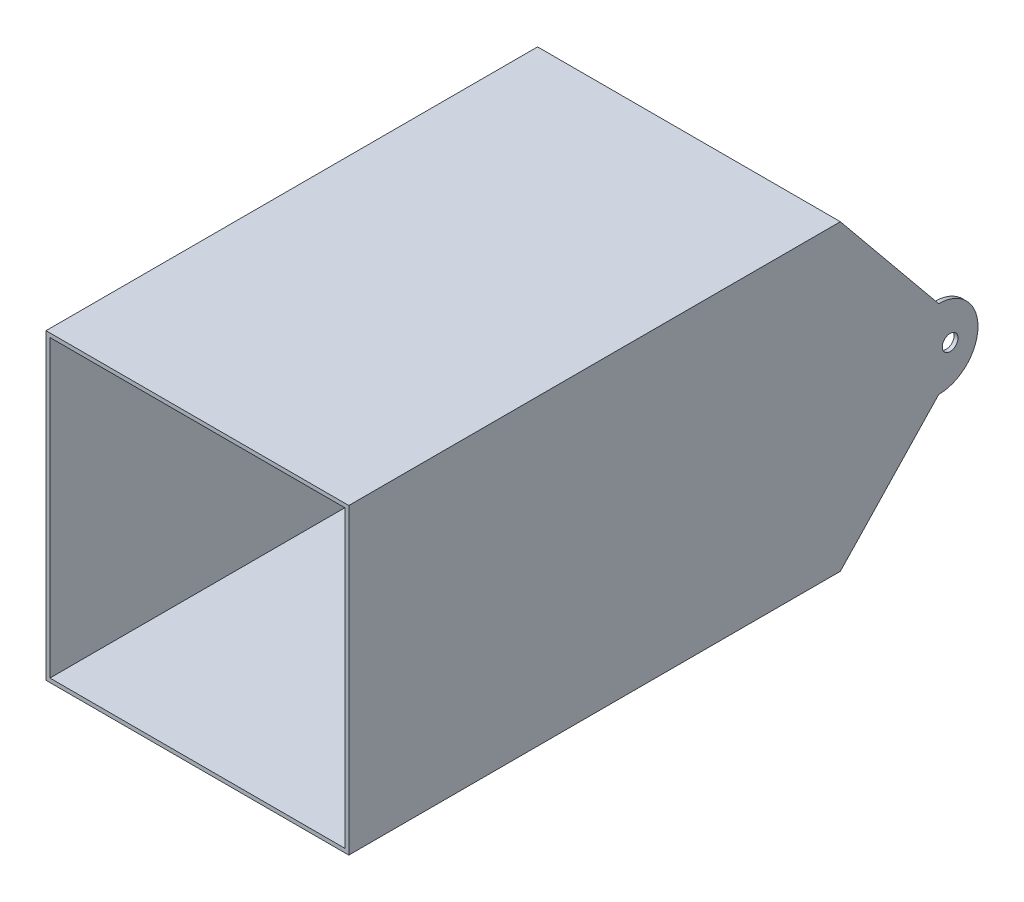
ISO-10303-21;
HEADER;
FILE_DESCRIPTION(('STEP AP214'),'2;1');
FILE_NAME('part.step','',(''),(''),'','','');
FILE_SCHEMA(('AUTOMOTIVE_DESIGN { 1 0 10303 214 1 1 1 1 }'));
ENDSEC;
DATA;
#1=APPLICATION_CONTEXT('core data for automotive mechanical design processes');
#2=APPLICATION_PROTOCOL_DEFINITION('international standard','automotive_design',2000,#1);
#3=PRODUCT_CONTEXT('',#1,'mechanical');
#4=PRODUCT('Part','Part','',(#3));
#5=PRODUCT_RELATED_PRODUCT_CATEGORY('part','',(#4));
#6=PRODUCT_DEFINITION_FORMATION('','',#4);
#7=PRODUCT_DEFINITION_CONTEXT('part definition',#1,'design');
#8=PRODUCT_DEFINITION('design','',#6,#7);
#9=PRODUCT_DEFINITION_SHAPE('','',#8);
#10=(LENGTH_UNIT() NAMED_UNIT(*) SI_UNIT(.MILLI.,.METRE.));
#11=(NAMED_UNIT(*) PLANE_ANGLE_UNIT() SI_UNIT($,.RADIAN.));
#12=(NAMED_UNIT(*) SI_UNIT($,.STERADIAN.) SOLID_ANGLE_UNIT());
#13=UNCERTAINTY_MEASURE_WITH_UNIT(LENGTH_MEASURE(1.E-05),#10,'distance_accuracy_value','');
#14=(GEOMETRIC_REPRESENTATION_CONTEXT(3) GLOBAL_UNCERTAINTY_ASSIGNED_CONTEXT((#13)) GLOBAL_UNIT_ASSIGNED_CONTEXT((#10,
#11,#12)) REPRESENTATION_CONTEXT('',''));
#15=CARTESIAN_POINT('',(0.,0.,0.));
#16=DIRECTION('',(0.,0.,1.));
#17=DIRECTION('',(1.,0.,0.));
#18=AXIS2_PLACEMENT_3D('',#15,#16,#17);
#19=CARTESIAN_POINT('',(0.,0.,-50.));
#20=DIRECTION('',(0.,0.,1.));
#21=DIRECTION('',(1.,0.,0.));
#22=AXIS2_PLACEMENT_3D('',#19,#20,#21);
#23=PLANE('',#22);
#24=DIRECTION('',(1.,0.,0.));
#25=VECTOR('',#24,1.);
#26=CARTESIAN_POINT('',(-77.,-24.1126862652198,-50.));
#27=LINE('',#26,#25);
#28=CARTESIAN_POINT('',(-75.,-24.1126862652198,-50.));
#29=VERTEX_POINT('',#28);
#30=CARTESIAN_POINT('',(75.,-24.1126862652198,-50.));
#31=VERTEX_POINT('',#30);
#32=EDGE_CURVE('E217',#29,#31,#27,.T.);
#33=ORIENTED_EDGE('',*,*,#32,.F.);
#34=DIRECTION('',(0.,-1.,0.));
#35=VECTOR('',#34,1.);
#36=CARTESIAN_POINT('',(-75.,77.,-50.));
#37=LINE('',#36,#35);
#38=CARTESIAN_POINT('',(-75.,-22.1126862652198,-50.));
#39=VERTEX_POINT('',#38);
#40=EDGE_CURVE('E479',#39,#29,#37,.T.);
#41=ORIENTED_EDGE('',*,*,#40,.F.);
#42=DIRECTION('',(1.,0.,0.));
#43=VECTOR('',#42,1.);
#44=CARTESIAN_POINT('',(-75.,-22.1126862652198,-50.));
#45=LINE('',#44,#43);
#46=CARTESIAN_POINT('',(75.,-22.1126862652198,-50.));
#47=VERTEX_POINT('',#46);
#48=EDGE_CURVE('E168',#39,#47,#45,.T.);
#49=ORIENTED_EDGE('',*,*,#48,.T.);
#50=DIRECTION('',(0.,-1.,0.));
#51=VECTOR('',#50,1.);
#52=CARTESIAN_POINT('',(75.,15.8873137347802,-50.));
#53=LINE('',#52,#51);
#54=EDGE_CURVE('E485',#47,#31,#53,.T.);
#55=ORIENTED_EDGE('',*,*,#54,.T.);
#56=EDGE_LOOP('',(#33,#41,#49,#55));
#57=FACE_BOUND('',#56,.T.);
#58=ADVANCED_FACE('F51',(#57),#23,.F.);
#59=DIRECTION('',(1.,0.,0.));
#60=VECTOR('',#59,1.);
#61=CARTESIAN_POINT('',(-75.,13.8873137347802,-50.));
#62=LINE('',#61,#60);
#63=CARTESIAN_POINT('',(-75.,13.8873137347802,-50.));
#64=VERTEX_POINT('',#63);
#65=CARTESIAN_POINT('',(75.,13.8873137347802,-50.));
#66=VERTEX_POINT('',#65);
#67=EDGE_CURVE('E523',#64,#66,#62,.T.);
#68=ORIENTED_EDGE('',*,*,#67,.F.);
#69=CARTESIAN_POINT('',(-75.,15.8873137347802,-50.));
#70=VERTEX_POINT('',#69);
#71=EDGE_CURVE('E259',#70,#64,#37,.T.);
#72=ORIENTED_EDGE('',*,*,#71,.F.);
#73=DIRECTION('',(1.,0.,0.));
#74=VECTOR('',#73,1.);
#75=CARTESIAN_POINT('',(-77.,15.8873137347802,-50.));
#76=LINE('',#75,#74);
#77=CARTESIAN_POINT('',(75.,15.8873137347802,-50.));
#78=VERTEX_POINT('',#77);
#79=EDGE_CURVE('E227',#70,#78,#76,.T.);
#80=ORIENTED_EDGE('',*,*,#79,.T.);
#81=EDGE_CURVE('E302',#78,#66,#53,.T.);
#82=ORIENTED_EDGE('',*,*,#81,.T.);
#83=EDGE_LOOP('',(#68,#72,#80,#82));
#84=FACE_BOUND('',#83,.T.);
#85=ADVANCED_FACE('F175',(#84),#23,.F.);
#86=CARTESIAN_POINT('',(0.,0.,250.));
#87=DIRECTION('',(0.,0.,1.));
#88=DIRECTION('',(1.,0.,0.));
#89=AXIS2_PLACEMENT_3D('',#86,#87,#88);
#90=PLANE('',#89);
#91=DIRECTION('',(0.,-1.,0.));
#92=VECTOR('',#91,1.);
#93=CARTESIAN_POINT('',(-77.,77.,250.));
#94=LINE('',#93,#92);
#95=CARTESIAN_POINT('',(-77.,77.,250.));
#96=VERTEX_POINT('',#95);
#97=CARTESIAN_POINT('',(-77.,-77.,250.));
#98=VERTEX_POINT('',#97);
#99=EDGE_CURVE('E157',#96,#98,#94,.T.);
#100=ORIENTED_EDGE('',*,*,#99,.T.);
#101=DIRECTION('',(1.,0.,0.));
#102=VECTOR('',#101,1.);
#103=CARTESIAN_POINT('',(-77.,-77.,250.));
#104=LINE('',#103,#102);
#105=CARTESIAN_POINT('',(77.,-77.,250.));
#106=VERTEX_POINT('',#105);
#107=EDGE_CURVE('E131',#98,#106,#104,.T.);
#108=ORIENTED_EDGE('',*,*,#107,.T.);
#109=DIRECTION('',(0.,1.,0.));
#110=VECTOR('',#109,1.);
#111=CARTESIAN_POINT('',(77.,77.,250.));
#112=LINE('',#111,#110);
#113=CARTESIAN_POINT('',(77.,77.,250.));
#114=VERTEX_POINT('',#113);
#115=EDGE_CURVE('E123',#106,#114,#112,.T.);
#116=ORIENTED_EDGE('',*,*,#115,.T.);
#117=DIRECTION('',(-1.,0.,0.));
#118=VECTOR('',#117,1.);
#119=CARTESIAN_POINT('',(-77.,77.,250.));
#120=LINE('',#119,#118);
#121=EDGE_CURVE('E129',#114,#96,#120,.T.);
#122=ORIENTED_EDGE('',*,*,#121,.T.);
#123=EDGE_LOOP('',(#100,#108,#116,#122));
#124=FACE_BOUND('',#123,.T.);
#125=DIRECTION('',(-1.,0.,0.));
#126=VECTOR('',#125,1.);
#127=CARTESIAN_POINT('',(-75.,75.,250.));
#128=LINE('',#127,#126);
#129=CARTESIAN_POINT('',(75.,75.,250.));
#130=VERTEX_POINT('',#129);
#131=CARTESIAN_POINT('',(-75.,75.,250.));
#132=VERTEX_POINT('',#131);
#133=EDGE_CURVE('E603',#130,#132,#128,.T.);
#134=ORIENTED_EDGE('',*,*,#133,.F.);
#135=DIRECTION('',(0.,1.,0.));
#136=VECTOR('',#135,1.);
#137=CARTESIAN_POINT('',(75.,75.,250.));
#138=LINE('',#137,#136);
#139=CARTESIAN_POINT('',(75.,-75.,250.));
#140=VERTEX_POINT('',#139);
#141=EDGE_CURVE('E205',#140,#130,#138,.T.);
#142=ORIENTED_EDGE('',*,*,#141,.F.);
#143=DIRECTION('',(1.,0.,0.));
#144=VECTOR('',#143,1.);
#145=CARTESIAN_POINT('',(-75.,-75.,250.));
#146=LINE('',#145,#144);
#147=CARTESIAN_POINT('',(-75.,-75.,250.));
#148=VERTEX_POINT('',#147);
#149=EDGE_CURVE('E110',#148,#140,#146,.T.);
#150=ORIENTED_EDGE('',*,*,#149,.F.);
#151=DIRECTION('',(0.,-1.,0.));
#152=VECTOR('',#151,1.);
#153=CARTESIAN_POINT('',(-75.,75.,250.));
#154=LINE('',#153,#152);
#155=EDGE_CURVE('E606',#132,#148,#154,.T.);
#156=ORIENTED_EDGE('',*,*,#155,.F.);
#157=EDGE_LOOP('',(#134,#142,#150,#156));
#158=FACE_BOUND('',#157,.T.);
#159=ADVANCED_FACE('F126',(#124,#158),#90,.T.);
#160=CARTESIAN_POINT('',(-77.,77.,250.));
#161=DIRECTION('',(1.,0.,0.));
#162=DIRECTION('',(0.,1.,0.));
#163=AXIS2_PLACEMENT_3D('',#160,#161,#162);
#164=PLANE('',#163);
#165=CARTESIAN_POINT('',(-77.,-4.11268626522006,-55.8343530717739));
#166=DIRECTION('',(1.,0.,0.));
#167=DIRECTION('',(0.,1.,0.));
#168=AXIS2_PLACEMENT_3D('',#165,#166,#167);
#169=CIRCLE('',#168,4.00000000000001);
#170=CARTESIAN_POINT('',(-77.,-0.112686265220057,-55.8343530717739));
#171=VERTEX_POINT('',#170);
#172=EDGE_CURVE('E468',#171,#171,#169,.T.);
#173=ORIENTED_EDGE('',*,*,#172,.T.);
#174=EDGE_LOOP('',(#173));
#175=FACE_BOUND('',#174,.T.);
#176=DIRECTION('',(0.,0.,-1.));
#177=VECTOR('',#176,1.);
#178=CARTESIAN_POINT('',(-77.,77.,250.));
#179=LINE('',#178,#177);
#180=CARTESIAN_POINT('',(-77.,77.,0.));
#181=VERTEX_POINT('',#180);
#182=EDGE_CURVE('E145',#96,#181,#179,.T.);
#183=ORIENTED_EDGE('',*,*,#182,.T.);
#184=DIRECTION('',(0.,0.773965298346349,0.633228013400897));
#185=VECTOR('',#184,1.);
#186=CARTESIAN_POINT('',(-77.,15.8873137347802,-50.));
#187=LINE('',#186,#185);
#188=CARTESIAN_POINT('',(-77.,15.8873137347802,-50.));
#189=VERTEX_POINT('',#188);
#190=EDGE_CURVE('E241',#189,#181,#187,.T.);
#191=ORIENTED_EDGE('',*,*,#190,.F.);
#192=CARTESIAN_POINT('',(-77.,-4.11268626521983,-50.));
#193=DIRECTION('',(1.,0.,0.));
#194=DIRECTION('',(0.,1.,0.));
#195=AXIS2_PLACEMENT_3D('',#192,#193,#194);
#196=CIRCLE('',#195,20.);
#197=CARTESIAN_POINT('',(-77.,-24.1126862652198,-50.));
#198=VERTEX_POINT('',#197);
#199=EDGE_CURVE('E471',#198,#189,#196,.T.);
#200=ORIENTED_EDGE('',*,*,#199,.F.);
#201=DIRECTION('',(0.,-0.726664153035787,0.686992873829694));
#202=VECTOR('',#201,1.);
#203=CARTESIAN_POINT('',(-77.,-24.1126862652198,-50.));
#204=LINE('',#203,#202);
#205=CARTESIAN_POINT('',(-77.,-77.,0.));
#206=VERTEX_POINT('',#205);
#207=EDGE_CURVE('E311',#198,#206,#204,.T.);
#208=ORIENTED_EDGE('',*,*,#207,.T.);
#209=DIRECTION('',(0.,0.,-1.));
#210=VECTOR('',#209,1.);
#211=CARTESIAN_POINT('',(-77.,-77.,250.));
#212=LINE('',#211,#210);
#213=EDGE_CURVE('E12',#98,#206,#212,.T.);
#214=ORIENTED_EDGE('',*,*,#213,.F.);
#215=ORIENTED_EDGE('',*,*,#99,.F.);
#216=EDGE_LOOP('',(#183,#191,#200,#208,#214,#215));
#217=FACE_BOUND('',#216,.T.);
#218=ADVANCED_FACE('F53',(#175,#217),#164,.F.);
#219=CARTESIAN_POINT('',(-77.,-77.,250.));
#220=DIRECTION('',(0.,1.,0.));
#221=DIRECTION('',(-1.,0.,0.));
#222=AXIS2_PLACEMENT_3D('',#219,#220,#221);
#223=PLANE('',#222);
#224=DIRECTION('',(-1.,0.,0.));
#225=VECTOR('',#224,1.);
#226=CARTESIAN_POINT('',(-77.,-77.,0.));
#227=LINE('',#226,#225);
#228=CARTESIAN_POINT('',(77.,-77.,0.));
#229=VERTEX_POINT('',#228);
#230=EDGE_CURVE('E158',#206,#229,#227,.F.);
#231=ORIENTED_EDGE('',*,*,#230,.T.);
#232=DIRECTION('',(0.,0.,-1.));
#233=VECTOR('',#232,1.);
#234=CARTESIAN_POINT('',(77.,-77.,250.));
#235=LINE('',#234,#233);
#236=EDGE_CURVE('E60',#106,#229,#235,.T.);
#237=ORIENTED_EDGE('',*,*,#236,.F.);
#238=ORIENTED_EDGE('',*,*,#107,.F.);
#239=ORIENTED_EDGE('',*,*,#213,.T.);
#240=EDGE_LOOP('',(#231,#237,#238,#239));
#241=FACE_BOUND('',#240,.T.);
#242=ADVANCED_FACE('F384',(#241),#223,.F.);
#243=CARTESIAN_POINT('',(77.,77.,250.));
#244=DIRECTION('',(-1.,0.,0.));
#245=DIRECTION('',(0.,-1.,0.));
#246=AXIS2_PLACEMENT_3D('',#243,#244,#245);
#247=PLANE('',#246);
#248=CARTESIAN_POINT('',(77.,-4.11268626522004,-55.8343530717739));
#249=DIRECTION('',(-1.,0.,0.));
#250=DIRECTION('',(0.,-1.,0.));
#251=AXIS2_PLACEMENT_3D('',#248,#249,#250);
#252=CIRCLE('',#251,4.00000000000001);
#253=CARTESIAN_POINT('',(77.,-0.112686265220029,-55.8343530717739));
#254=VERTEX_POINT('',#253);
#255=EDGE_CURVE('E467',#254,#254,#252,.T.);
#256=ORIENTED_EDGE('',*,*,#255,.T.);
#257=EDGE_LOOP('',(#256));
#258=FACE_BOUND('',#257,.T.);
#259=ORIENTED_EDGE('',*,*,#236,.T.);
#260=DIRECTION('',(0.,-0.726664153035787,0.686992873829694));
#261=VECTOR('',#260,1.);
#262=CARTESIAN_POINT('',(77.,-24.1126862652198,-50.));
#263=LINE('',#262,#261);
#264=CARTESIAN_POINT('',(77.,-24.1126862652198,-50.));
#265=VERTEX_POINT('',#264);
#266=EDGE_CURVE('E101',#265,#229,#263,.T.);
#267=ORIENTED_EDGE('',*,*,#266,.F.);
#268=CARTESIAN_POINT('',(77.,-4.1126862652198,-50.));
#269=DIRECTION('',(1.,0.,0.));
#270=DIRECTION('',(0.,1.,0.));
#271=AXIS2_PLACEMENT_3D('',#268,#269,#270);
#272=CIRCLE('',#271,20.);
#273=CARTESIAN_POINT('',(77.,15.8873137347802,-50.));
#274=VERTEX_POINT('',#273);
#275=EDGE_CURVE('E256',#265,#274,#272,.T.);
#276=ORIENTED_EDGE('',*,*,#275,.T.);
#277=DIRECTION('',(0.,0.773965298346349,0.633228013400897));
#278=VECTOR('',#277,1.);
#279=CARTESIAN_POINT('',(77.,15.8873137347802,-50.));
#280=LINE('',#279,#278);
#281=CARTESIAN_POINT('',(77.,77.,0.));
#282=VERTEX_POINT('',#281);
#283=EDGE_CURVE('E142',#274,#282,#280,.T.);
#284=ORIENTED_EDGE('',*,*,#283,.T.);
#285=DIRECTION('',(0.,0.,-1.));
#286=VECTOR('',#285,1.);
#287=CARTESIAN_POINT('',(77.,77.,250.));
#288=LINE('',#287,#286);
#289=EDGE_CURVE('E138',#114,#282,#288,.T.);
#290=ORIENTED_EDGE('',*,*,#289,.F.);
#291=ORIENTED_EDGE('',*,*,#115,.F.);
#292=EDGE_LOOP('',(#259,#267,#276,#284,#290,#291));
#293=FACE_BOUND('',#292,.T.);
#294=ADVANCED_FACE('F139',(#258,#293),#247,.F.);
#295=CARTESIAN_POINT('',(-77.,77.,250.));
#296=DIRECTION('',(0.,-1.,0.));
#297=DIRECTION('',(0.,0.,-1.));
#298=AXIS2_PLACEMENT_3D('',#295,#296,#297);
#299=PLANE('',#298);
#300=DIRECTION('',(1.,0.,0.));
#301=VECTOR('',#300,1.);
#302=CARTESIAN_POINT('',(-77.,77.,0.));
#303=LINE('',#302,#301);
#304=EDGE_CURVE('E155',#282,#181,#303,.F.);
#305=ORIENTED_EDGE('',*,*,#304,.T.);
#306=ORIENTED_EDGE('',*,*,#182,.F.);
#307=ORIENTED_EDGE('',*,*,#121,.F.);
#308=ORIENTED_EDGE('',*,*,#289,.T.);
#309=EDGE_LOOP('',(#305,#306,#307,#308));
#310=FACE_BOUND('',#309,.T.);
#311=ADVANCED_FACE('F147',(#310),#299,.F.);
#312=CARTESIAN_POINT('',(75.,75.,250.));
#313=DIRECTION('',(-1.,0.,0.));
#314=DIRECTION('',(0.,-1.,0.));
#315=AXIS2_PLACEMENT_3D('',#312,#313,#314);
#316=PLANE('',#315);
#317=CARTESIAN_POINT('',(75.,-4.11268626522004,-55.8343530717739));
#318=DIRECTION('',(-1.,0.,0.));
#319=DIRECTION('',(0.,-1.,0.));
#320=AXIS2_PLACEMENT_3D('',#317,#318,#319);
#321=CIRCLE('',#320,4.00000000000001);
#322=CARTESIAN_POINT('',(75.,-0.112686265220029,-55.8343530717739));
#323=VERTEX_POINT('',#322);
#324=EDGE_CURVE('E464',#323,#323,#321,.T.);
#325=ORIENTED_EDGE('',*,*,#324,.F.);
#326=EDGE_LOOP('',(#325));
#327=FACE_BOUND('',#326,.T.);
#328=DIRECTION('',(0.,0.,-1.));
#329=VECTOR('',#328,1.);
#330=CARTESIAN_POINT('',(75.,75.,250.));
#331=LINE('',#330,#329);
#332=CARTESIAN_POINT('',(75.,75.,0.));
#333=VERTEX_POINT('',#332);
#334=EDGE_CURVE('E160',#130,#333,#331,.T.);
#335=ORIENTED_EDGE('',*,*,#334,.T.);
#336=DIRECTION('',(0.,0.773965298346349,0.633228013400898));
#337=VECTOR('',#336,1.);
#338=CARTESIAN_POINT('',(75.,13.8873137347802,-50.));
#339=LINE('',#338,#337);
#340=EDGE_CURVE('E490',#66,#333,#339,.T.);
#341=ORIENTED_EDGE('',*,*,#340,.F.);
#342=ORIENTED_EDGE('',*,*,#81,.F.);
#343=CARTESIAN_POINT('',(75.,-4.1126862652198,-50.));
#344=DIRECTION('',(1.,0.,0.));
#345=DIRECTION('',(0.,1.,0.));
#346=AXIS2_PLACEMENT_3D('',#343,#344,#345);
#347=CIRCLE('',#346,20.);
#348=EDGE_CURVE('E258',#31,#78,#347,.T.);
#349=ORIENTED_EDGE('',*,*,#348,.F.);
#350=ORIENTED_EDGE('',*,*,#54,.F.);
#351=DIRECTION('',(0.,-0.726664153035787,0.686992873829695));
#352=VECTOR('',#351,1.);
#353=CARTESIAN_POINT('',(75.,-22.1126862652198,-50.));
#354=LINE('',#353,#352);
#355=CARTESIAN_POINT('',(75.,-75.,0.));
#356=VERTEX_POINT('',#355);
#357=EDGE_CURVE('E496',#47,#356,#354,.T.);
#358=ORIENTED_EDGE('',*,*,#357,.T.);
#359=DIRECTION('',(0.,0.,-1.));
#360=VECTOR('',#359,1.);
#361=CARTESIAN_POINT('',(75.,-75.,250.));
#362=LINE('',#361,#360);
#363=EDGE_CURVE('E345',#140,#356,#362,.T.);
#364=ORIENTED_EDGE('',*,*,#363,.F.);
#365=ORIENTED_EDGE('',*,*,#141,.T.);
#366=EDGE_LOOP('',(#335,#341,#342,#349,#350,#358,#364,#365));
#367=FACE_BOUND('',#366,.T.);
#368=ADVANCED_FACE('F375',(#327,#367),#316,.T.);
#369=CARTESIAN_POINT('',(-75.,75.,250.));
#370=DIRECTION('',(0.,-1.,0.));
#371=DIRECTION('',(0.,0.,-1.));
#372=AXIS2_PLACEMENT_3D('',#369,#370,#371);
#373=PLANE('',#372);
#374=CARTESIAN_POINT('',(75.,75.,0.));
#375=DIRECTION('',(-1.,0.,0.));
#376=VECTOR('',#375,1.);
#377=LINE('',#374,#376);
#378=CARTESIAN_POINT('',(-75.,75.,0.));
#379=VERTEX_POINT('',#378);
#380=EDGE_CURVE('E303',#333,#379,#377,.T.);
#381=ORIENTED_EDGE('',*,*,#380,.F.);
#382=ORIENTED_EDGE('',*,*,#334,.F.);
#383=ORIENTED_EDGE('',*,*,#133,.T.);
#384=DIRECTION('',(0.,0.,-1.));
#385=VECTOR('',#384,1.);
#386=CARTESIAN_POINT('',(-75.,75.,250.));
#387=LINE('',#386,#385);
#388=EDGE_CURVE('E356',#132,#379,#387,.T.);
#389=ORIENTED_EDGE('',*,*,#388,.T.);
#390=EDGE_LOOP('',(#381,#382,#383,#389));
#391=FACE_BOUND('',#390,.T.);
#392=ADVANCED_FACE('F366',(#391),#373,.T.);
#393=CARTESIAN_POINT('',(-75.,75.,250.));
#394=DIRECTION('',(1.,0.,0.));
#395=DIRECTION('',(0.,1.,0.));
#396=AXIS2_PLACEMENT_3D('',#393,#394,#395);
#397=PLANE('',#396);
#398=CARTESIAN_POINT('',(-75.,-4.11268626522006,-55.8343530717739));
#399=DIRECTION('',(1.,0.,0.));
#400=DIRECTION('',(0.,1.,0.));
#401=AXIS2_PLACEMENT_3D('',#398,#399,#400);
#402=CIRCLE('',#401,4.00000000000001);
#403=CARTESIAN_POINT('',(-75.,-0.112686265220056,-55.8343530717739));
#404=VERTEX_POINT('',#403);
#405=EDGE_CURVE('E55',#404,#404,#402,.T.);
#406=ORIENTED_EDGE('',*,*,#405,.F.);
#407=EDGE_LOOP('',(#406));
#408=FACE_BOUND('',#407,.T.);
#409=DIRECTION('',(0.,0.,-1.));
#410=VECTOR('',#409,1.);
#411=CARTESIAN_POINT('',(-75.,-75.,250.));
#412=LINE('',#411,#410);
#413=CARTESIAN_POINT('',(-75.,-75.,0.));
#414=VERTEX_POINT('',#413);
#415=EDGE_CURVE('E77',#148,#414,#412,.T.);
#416=ORIENTED_EDGE('',*,*,#415,.T.);
#417=DIRECTION('',(0.,-0.726664153035787,0.686992873829695));
#418=VECTOR('',#417,1.);
#419=CARTESIAN_POINT('',(-75.,-22.1126862652198,-50.));
#420=LINE('',#419,#418);
#421=EDGE_CURVE('E493',#39,#414,#420,.T.);
#422=ORIENTED_EDGE('',*,*,#421,.F.);
#423=ORIENTED_EDGE('',*,*,#40,.T.);
#424=CARTESIAN_POINT('',(-75.,-4.11268626521983,-50.));
#425=DIRECTION('',(1.,0.,0.));
#426=DIRECTION('',(0.,1.,0.));
#427=AXIS2_PLACEMENT_3D('',#424,#425,#426);
#428=CIRCLE('',#427,20.);
#429=EDGE_CURVE('E68',#29,#70,#428,.T.);
#430=ORIENTED_EDGE('',*,*,#429,.T.);
#431=ORIENTED_EDGE('',*,*,#71,.T.);
#432=DIRECTION('',(0.,0.773965298346349,0.633228013400898));
#433=VECTOR('',#432,1.);
#434=CARTESIAN_POINT('',(-75.,13.8873137347802,-50.));
#435=LINE('',#434,#433);
#436=EDGE_CURVE('E487',#64,#379,#435,.T.);
#437=ORIENTED_EDGE('',*,*,#436,.T.);
#438=ORIENTED_EDGE('',*,*,#388,.F.);
#439=ORIENTED_EDGE('',*,*,#155,.T.);
#440=EDGE_LOOP('',(#416,#422,#423,#430,#431,#437,#438,#439));
#441=FACE_BOUND('',#440,.T.);
#442=ADVANCED_FACE('F337',(#408,#441),#397,.T.);
#443=CARTESIAN_POINT('',(-75.,-75.,250.));
#444=DIRECTION('',(0.,1.,0.));
#445=DIRECTION('',(0.,0.,1.));
#446=AXIS2_PLACEMENT_3D('',#443,#444,#445);
#447=PLANE('',#446);
#448=CARTESIAN_POINT('',(-75.,-75.,0.));
#449=DIRECTION('',(1.,0.,0.));
#450=VECTOR('',#449,1.);
#451=LINE('',#448,#450);
#452=EDGE_CURVE('E305',#414,#356,#451,.T.);
#453=ORIENTED_EDGE('',*,*,#452,.F.);
#454=ORIENTED_EDGE('',*,*,#415,.F.);
#455=ORIENTED_EDGE('',*,*,#149,.T.);
#456=ORIENTED_EDGE('',*,*,#363,.T.);
#457=EDGE_LOOP('',(#453,#454,#455,#456));
#458=FACE_BOUND('',#457,.T.);
#459=ADVANCED_FACE('F333',(#458),#447,.T.);
#460=CARTESIAN_POINT('',(0.,30.8752842055848,-37.737431140108));
#461=DIRECTION('',(0.,-0.633228013400897,0.773965298346349));
#462=DIRECTION('',(0.,-0.773965298346349,-0.633228013400897));
#463=AXIS2_PLACEMENT_3D('',#460,#461,#462);
#464=PLANE('',#463);
#465=ORIENTED_EDGE('',*,*,#190,.T.);
#466=ORIENTED_EDGE('',*,*,#304,.F.);
#467=ORIENTED_EDGE('',*,*,#283,.F.);
#468=CARTESIAN_POINT('',(75.,15.8873137347802,-50.));
#469=DIRECTION('',(1.,0.,0.));
#470=VECTOR('',#469,1.);
#471=LINE('',#468,#470);
#472=EDGE_CURVE('E254',#78,#274,#471,.T.);
#473=ORIENTED_EDGE('',*,*,#472,.F.);
#474=ORIENTED_EDGE('',*,*,#79,.F.);
#475=EDGE_CURVE('E314',#189,#70,#76,.T.);
#476=ORIENTED_EDGE('',*,*,#475,.F.);
#477=EDGE_LOOP('',(#465,#466,#467,#473,#474,#476));
#478=FACE_BOUND('',#477,.T.);
#479=ADVANCED_FACE('F189',(#478),#464,.F.);
#480=CARTESIAN_POINT('',(0.,-36.3408590693443,-38.4394082998369));
#481=DIRECTION('',(0.,-0.686992873829694,-0.726664153035787));
#482=DIRECTION('',(0.,0.726664153035787,-0.686992873829695));
#483=AXIS2_PLACEMENT_3D('',#480,#481,#482);
#484=PLANE('',#483);
#485=ORIENTED_EDGE('',*,*,#266,.T.);
#486=ORIENTED_EDGE('',*,*,#230,.F.);
#487=ORIENTED_EDGE('',*,*,#207,.F.);
#488=EDGE_CURVE('E318',#198,#29,#27,.T.);
#489=ORIENTED_EDGE('',*,*,#488,.T.);
#490=ORIENTED_EDGE('',*,*,#32,.T.);
#491=CARTESIAN_POINT('',(75.,-24.1126862652198,-50.));
#492=DIRECTION('',(1.,0.,0.));
#493=VECTOR('',#492,1.);
#494=LINE('',#491,#493);
#495=EDGE_CURVE('E267',#31,#265,#494,.T.);
#496=ORIENTED_EDGE('',*,*,#495,.T.);
#497=EDGE_LOOP('',(#485,#486,#487,#489,#490,#496));
#498=FACE_BOUND('',#497,.T.);
#499=ADVANCED_FACE('F324',(#498),#484,.T.);
#500=CARTESIAN_POINT('',(0.,30.0733287716735,-36.7572381234819));
#501=DIRECTION('',(0.,0.633228013400898,-0.773965298346349));
#502=DIRECTION('',(0.,0.773965298346349,0.633228013400898));
#503=AXIS2_PLACEMENT_3D('',#500,#501,#502);
#504=PLANE('',#503);
#505=ORIENTED_EDGE('',*,*,#436,.F.);
#506=ORIENTED_EDGE('',*,*,#67,.T.);
#507=ORIENTED_EDGE('',*,*,#340,.T.);
#508=ORIENTED_EDGE('',*,*,#380,.T.);
#509=EDGE_LOOP('',(#505,#506,#507,#508));
#510=FACE_BOUND('',#509,.T.);
#511=ADVANCED_FACE('F286',(#510),#504,.F.);
#512=CARTESIAN_POINT('',(0.,-35.3969406519587,-37.4409821102307));
#513=DIRECTION('',(0.,0.686992873829695,0.726664153035787));
#514=DIRECTION('',(0.,-0.726664153035787,0.686992873829695));
#515=AXIS2_PLACEMENT_3D('',#512,#513,#514);
#516=PLANE('',#515);
#517=ORIENTED_EDGE('',*,*,#357,.F.);
#518=ORIENTED_EDGE('',*,*,#48,.F.);
#519=ORIENTED_EDGE('',*,*,#421,.T.);
#520=ORIENTED_EDGE('',*,*,#452,.T.);
#521=EDGE_LOOP('',(#517,#518,#519,#520));
#522=FACE_BOUND('',#521,.T.);
#523=ADVANCED_FACE('F186',(#522),#516,.T.);
#524=CARTESIAN_POINT('',(75.,-4.1126862652198,-50.));
#525=DIRECTION('',(1.,0.,0.));
#526=DIRECTION('',(0.,1.,0.));
#527=AXIS2_PLACEMENT_3D('',#524,#525,#526);
#528=CYLINDRICAL_SURFACE('',#527,20.);
#529=ORIENTED_EDGE('',*,*,#275,.F.);
#530=ORIENTED_EDGE('',*,*,#495,.F.);
#531=ORIENTED_EDGE('',*,*,#348,.T.);
#532=ORIENTED_EDGE('',*,*,#472,.T.);
#533=EDGE_LOOP('',(#529,#530,#531,#532));
#534=FACE_BOUND('',#533,.T.);
#535=ADVANCED_FACE('F274',(#534),#528,.T.);
#536=CARTESIAN_POINT('',(-75.,-4.11268626521983,-50.));
#537=DIRECTION('',(-1.,0.,0.));
#538=DIRECTION('',(0.,-1.,0.));
#539=AXIS2_PLACEMENT_3D('',#536,#537,#538);
#540=CYLINDRICAL_SURFACE('',#539,20.);
#541=ORIENTED_EDGE('',*,*,#199,.T.);
#542=ORIENTED_EDGE('',*,*,#475,.T.);
#543=ORIENTED_EDGE('',*,*,#429,.F.);
#544=ORIENTED_EDGE('',*,*,#488,.F.);
#545=EDGE_LOOP('',(#541,#542,#543,#544));
#546=FACE_BOUND('',#545,.T.);
#547=ADVANCED_FACE('F283',(#546),#540,.T.);
#548=CARTESIAN_POINT('',(-77.0001,-4.11268626522006,-55.8343530717739));
#549=DIRECTION('',(1.,0.,0.));
#550=DIRECTION('',(0.,1.,0.));
#551=AXIS2_PLACEMENT_3D('',#548,#549,#550);
#552=CYLINDRICAL_SURFACE('',#551,4.00000000000001);
#553=CARTESIAN_POINT('',(-75.,-0.112686265220056,-55.8343530717739));
#554=CARTESIAN_POINT('',(-75.0208333333333,-0.112686265220056,-55.8343530717739));
#555=CARTESIAN_POINT('',(-75.0416666666667,-0.112686265220056,-55.8343530717739));
#556=CARTESIAN_POINT('',(-75.0833333333333,-0.112686265220056,-55.8343530717739));
#557=CARTESIAN_POINT('',(-75.1041666666667,-0.112686265220056,-55.8343530717739));
#558=CARTESIAN_POINT('',(-75.1458333333333,-0.112686265220056,-55.8343530717739));
#559=CARTESIAN_POINT('',(-75.1666666666667,-0.112686265220056,-55.8343530717739));
#560=CARTESIAN_POINT('',(-75.2083333333333,-0.112686265220056,-55.8343530717739));
#561=CARTESIAN_POINT('',(-75.2291666666667,-0.112686265220056,-55.8343530717739));
#562=CARTESIAN_POINT('',(-75.2708333333333,-0.112686265220056,-55.8343530717739));
#563=CARTESIAN_POINT('',(-75.2916666666667,-0.112686265220056,-55.8343530717739));
#564=CARTESIAN_POINT('',(-75.3333333333333,-0.112686265220056,-55.8343530717739));
#565=CARTESIAN_POINT('',(-75.3541666666667,-0.112686265220056,-55.8343530717739));
#566=CARTESIAN_POINT('',(-75.3958333333333,-0.112686265220056,-55.8343530717739));
#567=CARTESIAN_POINT('',(-75.4166666666667,-0.112686265220056,-55.8343530717739));
#568=CARTESIAN_POINT('',(-75.4583333333333,-0.112686265220056,-55.8343530717739));
#569=CARTESIAN_POINT('',(-75.4791666666667,-0.112686265220056,-55.8343530717739));
#570=CARTESIAN_POINT('',(-75.5208333333333,-0.112686265220056,-55.8343530717739));
#571=CARTESIAN_POINT('',(-75.5416666666667,-0.112686265220056,-55.8343530717739));
#572=CARTESIAN_POINT('',(-75.5833333333333,-0.112686265220056,-55.8343530717739));
#573=CARTESIAN_POINT('',(-75.6041666666667,-0.112686265220056,-55.8343530717739));
#574=CARTESIAN_POINT('',(-75.6458333333333,-0.112686265220056,-55.8343530717739));
#575=CARTESIAN_POINT('',(-75.6666666666667,-0.112686265220056,-55.8343530717739));
#576=CARTESIAN_POINT('',(-75.7083333333333,-0.112686265220056,-55.8343530717739));
#577=CARTESIAN_POINT('',(-75.7291666666667,-0.112686265220056,-55.8343530717739));
#578=CARTESIAN_POINT('',(-75.7708333333333,-0.112686265220056,-55.8343530717739));
#579=CARTESIAN_POINT('',(-75.7916666666667,-0.112686265220056,-55.8343530717739));
#580=CARTESIAN_POINT('',(-75.8333333333333,-0.112686265220056,-55.8343530717739));
#581=CARTESIAN_POINT('',(-75.8541666666667,-0.112686265220057,-55.8343530717739));
#582=CARTESIAN_POINT('',(-75.8958333333333,-0.112686265220057,-55.8343530717739));
#583=CARTESIAN_POINT('',(-75.9166666666667,-0.112686265220057,-55.8343530717739));
#584=CARTESIAN_POINT('',(-75.9583333333333,-0.112686265220057,-55.8343530717739));
#585=CARTESIAN_POINT('',(-75.9791666666667,-0.112686265220057,-55.8343530717739));
#586=CARTESIAN_POINT('',(-76.0208333333333,-0.112686265220057,-55.8343530717739));
#587=CARTESIAN_POINT('',(-76.0416666666667,-0.112686265220057,-55.8343530717739));
#588=CARTESIAN_POINT('',(-76.0833333333333,-0.112686265220057,-55.8343530717739));
#589=CARTESIAN_POINT('',(-76.1041666666667,-0.112686265220057,-55.8343530717739));
#590=CARTESIAN_POINT('',(-76.1458333333333,-0.112686265220057,-55.8343530717739));
#591=CARTESIAN_POINT('',(-76.1666666666667,-0.112686265220057,-55.8343530717739));
#592=CARTESIAN_POINT('',(-76.2083333333333,-0.112686265220057,-55.8343530717739));
#593=CARTESIAN_POINT('',(-76.2291666666667,-0.112686265220057,-55.8343530717739));
#594=CARTESIAN_POINT('',(-76.2708333333333,-0.112686265220057,-55.8343530717739));
#595=CARTESIAN_POINT('',(-76.2916666666667,-0.112686265220057,-55.8343530717739));
#596=CARTESIAN_POINT('',(-76.3333333333333,-0.112686265220057,-55.8343530717739));
#597=CARTESIAN_POINT('',(-76.3541666666667,-0.112686265220057,-55.8343530717739));
#598=CARTESIAN_POINT('',(-76.3958333333333,-0.112686265220057,-55.8343530717739));
#599=CARTESIAN_POINT('',(-76.4166666666667,-0.112686265220057,-55.8343530717739));
#600=CARTESIAN_POINT('',(-76.4583333333333,-0.112686265220057,-55.8343530717739));
#601=CARTESIAN_POINT('',(-76.4791666666667,-0.112686265220057,-55.8343530717739));
#602=CARTESIAN_POINT('',(-76.5208333333333,-0.112686265220057,-55.8343530717739));
#603=CARTESIAN_POINT('',(-76.5416666666667,-0.112686265220057,-55.8343530717739));
#604=CARTESIAN_POINT('',(-76.5833333333333,-0.112686265220057,-55.8343530717739));
#605=CARTESIAN_POINT('',(-76.6041666666667,-0.112686265220057,-55.8343530717739));
#606=CARTESIAN_POINT('',(-76.6458333333333,-0.112686265220057,-55.8343530717739));
#607=CARTESIAN_POINT('',(-76.6666666666667,-0.112686265220057,-55.8343530717739));
#608=CARTESIAN_POINT('',(-76.7083333333333,-0.112686265220057,-55.8343530717739));
#609=CARTESIAN_POINT('',(-76.7291666666667,-0.112686265220057,-55.8343530717739));
#610=CARTESIAN_POINT('',(-76.7708333333333,-0.112686265220057,-55.8343530717739));
#611=CARTESIAN_POINT('',(-76.7916666666667,-0.112686265220057,-55.8343530717739));
#612=CARTESIAN_POINT('',(-76.8333333333333,-0.112686265220057,-55.8343530717739));
#613=CARTESIAN_POINT('',(-76.8541666666667,-0.112686265220057,-55.8343530717739));
#614=CARTESIAN_POINT('',(-76.8958333333333,-0.112686265220057,-55.8343530717739));
#615=CARTESIAN_POINT('',(-76.9166666666667,-0.112686265220057,-55.8343530717739));
#616=CARTESIAN_POINT('',(-76.9583333333333,-0.112686265220057,-55.8343530717739));
#617=CARTESIAN_POINT('',(-76.9791666666667,-0.112686265220057,-55.8343530717739));
#618=CARTESIAN_POINT('',(-77.,-0.112686265220057,-55.8343530717739));
#619=B_SPLINE_CURVE_WITH_KNOTS('',3,(#553,#554,#555,#556,#557,#558,#559,#560,#561,#562,#563,
#564,#565,#566,#567,#568,#569,#570,#571,#572,#573,#574,#575,#576,#577,#578,#579,#580,#581,#582,
#583,#584,#585,#586,#587,#588,#589,#590,#591,#592,#593,#594,#595,#596,#597,#598,#599,#600,#601,
#602,#603,#604,#605,#606,#607,#608,#609,#610,#611,#612,#613,#614,#615,#616,#617,#618),
.UNSPECIFIED.,.F.,.F.,(4,2,2,2,2,2,2,2,2,2,2,2,2,2,2,2,2,2,2,2,2,2,2,2,2,2,2,2,2,2,2,2,4),(0.,
0.062500000000007,0.125,0.187500000000007,0.25,0.312500000000007,0.375,0.437500000000007,0.5,
0.562500000000007,0.625000000000001,0.687500000000008,0.750000000000001,0.812500000000008,
0.875000000000001,0.937500000000008,1.,1.06250000000001,1.125,1.18750000000001,1.25,
1.31250000000001,1.375,1.43750000000001,1.5,1.56250000000001,1.625,1.68750000000001,
1.75000000000002,1.81250000000001,1.87500000000002,1.93750000000001,2.00000000000002),.UNSPECIFIED.);
#620=EDGE_CURVE('BSEAM444',#404,#171,#619,.T.);
#621=ORIENTED_EDGE('',*,*,#405,.T.);
#622=ORIENTED_EDGE('',*,*,#172,.F.);
#623=ORIENTED_EDGE('',*,*,#620,.T.);
#624=ORIENTED_EDGE('',*,*,#620,.F.);
#625=EDGE_LOOP('',(#621,#623,#622,#624));
#626=FACE_BOUND('',#625,.T.);
#627=ADVANCED_FACE('F444',(#626),#552,.F.);
#628=CARTESIAN_POINT('',(75.,-0.112686265220029,-55.8343530717739));
#629=CARTESIAN_POINT('',(75.0208333333334,-0.112686265220029,-55.8343530717739));
#630=CARTESIAN_POINT('',(75.0416666666667,-0.112686265220029,-55.8343530717739));
#631=CARTESIAN_POINT('',(75.0833333333333,-0.112686265220029,-55.8343530717739));
#632=CARTESIAN_POINT('',(75.1041666666667,-0.112686265220029,-55.8343530717739));
#633=CARTESIAN_POINT('',(75.1458333333334,-0.112686265220029,-55.8343530717739));
#634=CARTESIAN_POINT('',(75.1666666666667,-0.112686265220029,-55.8343530717739));
#635=CARTESIAN_POINT('',(75.2083333333334,-0.112686265220029,-55.8343530717739));
#636=CARTESIAN_POINT('',(75.2291666666667,-0.112686265220029,-55.8343530717739));
#637=CARTESIAN_POINT('',(75.2708333333334,-0.112686265220029,-55.8343530717739));
#638=CARTESIAN_POINT('',(75.2916666666667,-0.112686265220029,-55.8343530717739));
#639=CARTESIAN_POINT('',(75.3333333333334,-0.112686265220029,-55.8343530717739));
#640=CARTESIAN_POINT('',(75.3541666666667,-0.112686265220029,-55.8343530717739));
#641=CARTESIAN_POINT('',(75.3958333333334,-0.112686265220029,-55.8343530717739));
#642=CARTESIAN_POINT('',(75.4166666666667,-0.112686265220029,-55.8343530717739));
#643=CARTESIAN_POINT('',(75.4583333333334,-0.112686265220029,-55.8343530717739));
#644=CARTESIAN_POINT('',(75.4791666666667,-0.112686265220029,-55.8343530717739));
#645=CARTESIAN_POINT('',(75.5208333333334,-0.112686265220029,-55.8343530717739));
#646=CARTESIAN_POINT('',(75.5416666666667,-0.112686265220029,-55.8343530717739));
#647=CARTESIAN_POINT('',(75.5833333333333,-0.112686265220029,-55.8343530717739));
#648=CARTESIAN_POINT('',(75.6041666666667,-0.112686265220029,-55.8343530717739));
#649=CARTESIAN_POINT('',(75.6458333333334,-0.112686265220029,-55.8343530717739));
#650=CARTESIAN_POINT('',(75.6666666666667,-0.112686265220029,-55.8343530717739));
#651=CARTESIAN_POINT('',(75.7083333333334,-0.112686265220029,-55.8343530717739));
#652=CARTESIAN_POINT('',(75.7291666666667,-0.112686265220029,-55.8343530717739));
#653=CARTESIAN_POINT('',(75.7708333333334,-0.112686265220029,-55.8343530717739));
#654=CARTESIAN_POINT('',(75.7916666666667,-0.112686265220029,-55.8343530717739));
#655=CARTESIAN_POINT('',(75.8333333333334,-0.112686265220029,-55.8343530717739));
#656=CARTESIAN_POINT('',(75.8541666666667,-0.112686265220029,-55.8343530717739));
#657=CARTESIAN_POINT('',(75.8958333333334,-0.112686265220029,-55.8343530717739));
#658=CARTESIAN_POINT('',(75.9166666666667,-0.112686265220029,-55.8343530717739));
#659=CARTESIAN_POINT('',(75.9583333333334,-0.112686265220029,-55.8343530717739));
#660=CARTESIAN_POINT('',(75.9791666666667,-0.112686265220029,-55.8343530717739));
#661=CARTESIAN_POINT('',(76.0208333333334,-0.112686265220029,-55.8343530717739));
#662=CARTESIAN_POINT('',(76.0416666666667,-0.112686265220029,-55.8343530717739));
#663=CARTESIAN_POINT('',(76.0833333333334,-0.112686265220029,-55.8343530717739));
#664=CARTESIAN_POINT('',(76.1041666666667,-0.112686265220029,-55.8343530717739));
#665=CARTESIAN_POINT('',(76.1458333333334,-0.112686265220029,-55.8343530717739));
#666=CARTESIAN_POINT('',(76.1666666666667,-0.112686265220029,-55.8343530717739));
#667=CARTESIAN_POINT('',(76.2083333333334,-0.112686265220029,-55.8343530717739));
#668=CARTESIAN_POINT('',(76.2291666666667,-0.112686265220029,-55.8343530717739));
#669=CARTESIAN_POINT('',(76.2708333333334,-0.112686265220029,-55.8343530717739));
#670=CARTESIAN_POINT('',(76.2916666666667,-0.112686265220029,-55.8343530717739));
#671=CARTESIAN_POINT('',(76.3333333333334,-0.112686265220029,-55.8343530717739));
#672=CARTESIAN_POINT('',(76.3541666666667,-0.112686265220029,-55.8343530717739));
#673=CARTESIAN_POINT('',(76.3958333333334,-0.112686265220029,-55.8343530717739));
#674=CARTESIAN_POINT('',(76.4166666666667,-0.112686265220029,-55.8343530717739));
#675=CARTESIAN_POINT('',(76.4583333333334,-0.112686265220029,-55.8343530717739));
#676=CARTESIAN_POINT('',(76.4791666666667,-0.112686265220029,-55.8343530717739));
#677=CARTESIAN_POINT('',(76.5208333333334,-0.112686265220029,-55.8343530717739));
#678=CARTESIAN_POINT('',(76.5416666666667,-0.112686265220029,-55.8343530717739));
#679=CARTESIAN_POINT('',(76.5833333333334,-0.112686265220029,-55.8343530717739));
#680=CARTESIAN_POINT('',(76.6041666666667,-0.112686265220029,-55.8343530717739));
#681=CARTESIAN_POINT('',(76.6458333333334,-0.112686265220029,-55.8343530717739));
#682=CARTESIAN_POINT('',(76.6666666666667,-0.112686265220029,-55.8343530717739));
#683=CARTESIAN_POINT('',(76.7083333333334,-0.112686265220029,-55.8343530717739));
#684=CARTESIAN_POINT('',(76.7291666666667,-0.112686265220029,-55.8343530717739));
#685=CARTESIAN_POINT('',(76.7708333333334,-0.112686265220029,-55.8343530717739));
#686=CARTESIAN_POINT('',(76.7916666666667,-0.112686265220029,-55.8343530717739));
#687=CARTESIAN_POINT('',(76.8333333333334,-0.112686265220029,-55.8343530717739));
#688=CARTESIAN_POINT('',(76.8541666666667,-0.112686265220029,-55.8343530717739));
#689=CARTESIAN_POINT('',(76.8958333333334,-0.112686265220029,-55.8343530717739));
#690=CARTESIAN_POINT('',(76.9166666666667,-0.112686265220029,-55.8343530717739));
#691=CARTESIAN_POINT('',(76.9583333333334,-0.112686265220029,-55.8343530717739));
#692=CARTESIAN_POINT('',(76.9791666666667,-0.112686265220029,-55.8343530717739));
#693=CARTESIAN_POINT('',(77.,-0.112686265220029,-55.8343530717739));
#694=B_SPLINE_CURVE_WITH_KNOTS('',3,(#628,#629,#630,#631,#632,#633,#634,#635,#636,#637,#638,
#639,#640,#641,#642,#643,#644,#645,#646,#647,#648,#649,#650,#651,#652,#653,#654,#655,#656,#657,
#658,#659,#660,#661,#662,#663,#664,#665,#666,#667,#668,#669,#670,#671,#672,#673,#674,#675,#676,
#677,#678,#679,#680,#681,#682,#683,#684,#685,#686,#687,#688,#689,#690,#691,#692,#693),
.UNSPECIFIED.,.F.,.F.,(4,2,2,2,2,2,2,2,2,2,2,2,2,2,2,2,2,2,2,2,2,2,2,2,2,2,2,2,2,2,2,2,4),(0.,
0.0624999999999931,0.124999999999986,0.187500000000007,0.25,0.312499999999993,0.375000000000014,
0.437500000000007,0.5,0.562499999999994,0.624999999999987,0.687500000000008,0.750000000000001,
0.812499999999994,0.875000000000015,0.937500000000008,1.,1.06249999999999,1.12499999999999,
1.18750000000001,1.25,1.31249999999999,1.37500000000002,1.43750000000001,1.5,1.56249999999999,
1.62499999999999,1.68750000000001,1.75,1.81249999999999,1.87500000000002,1.93750000000001,2.),.UNSPECIFIED.);
#695=EDGE_CURVE('BSEAM449',#323,#254,#694,.T.);
#696=ORIENTED_EDGE('',*,*,#324,.T.);
#697=ORIENTED_EDGE('',*,*,#255,.F.);
#698=ORIENTED_EDGE('',*,*,#695,.T.);
#699=ORIENTED_EDGE('',*,*,#695,.F.);
#700=EDGE_LOOP('',(#696,#698,#697,#699));
#701=FACE_BOUND('',#700,.T.);
#702=ADVANCED_FACE('F449',(#701),#552,.F.);
#703=CLOSED_SHELL('',(#58,#85,#159,#218,#242,#294,#311,#368,#392,#442,#459,#479,#499,#511,#523,
#535,#547,#627,#702));
#704=MANIFOLD_SOLID_BREP('B2',#703);
#705=ADVANCED_BREP_SHAPE_REPRESENTATION('',(#18,#704),#14);
#706=SHAPE_DEFINITION_REPRESENTATION(#9,#705);
ENDSEC;
END-ISO-10303-21;
